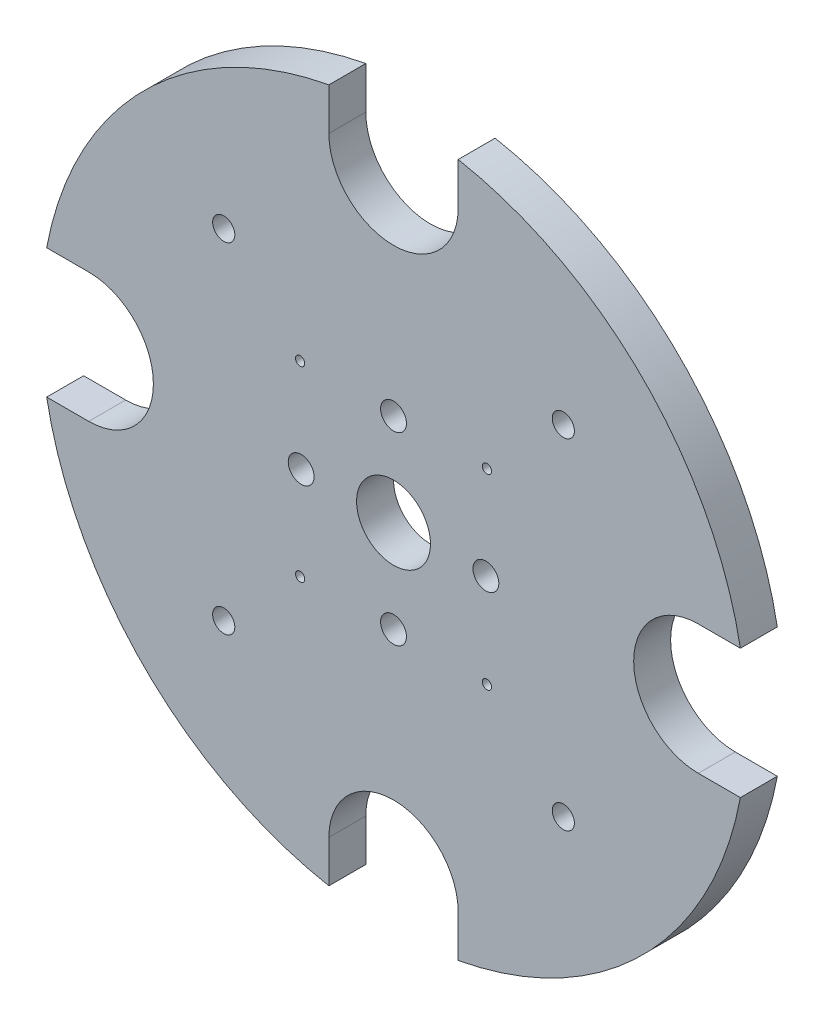
ISO-10303-21;
HEADER;
FILE_DESCRIPTION(('STEP AP214'),'2;1');
FILE_NAME('part.step','',(''),(''),'','','');
FILE_SCHEMA(('AUTOMOTIVE_DESIGN { 1 0 10303 214 1 1 1 1 }'));
ENDSEC;
DATA;
#1=APPLICATION_CONTEXT('core data for automotive mechanical design processes');
#2=APPLICATION_PROTOCOL_DEFINITION('international standard','automotive_design',2000,#1);
#3=PRODUCT_CONTEXT('',#1,'mechanical');
#4=PRODUCT('Part','Part','',(#3));
#5=PRODUCT_RELATED_PRODUCT_CATEGORY('part','',(#4));
#6=PRODUCT_DEFINITION_FORMATION('','',#4);
#7=PRODUCT_DEFINITION_CONTEXT('part definition',#1,'design');
#8=PRODUCT_DEFINITION('design','',#6,#7);
#9=PRODUCT_DEFINITION_SHAPE('','',#8);
#10=(LENGTH_UNIT() NAMED_UNIT(*) SI_UNIT(.MILLI.,.METRE.));
#11=(NAMED_UNIT(*) PLANE_ANGLE_UNIT() SI_UNIT($,.RADIAN.));
#12=(NAMED_UNIT(*) SI_UNIT($,.STERADIAN.) SOLID_ANGLE_UNIT());
#13=UNCERTAINTY_MEASURE_WITH_UNIT(LENGTH_MEASURE(1.E-05),#10,'distance_accuracy_value','');
#14=(GEOMETRIC_REPRESENTATION_CONTEXT(3) GLOBAL_UNCERTAINTY_ASSIGNED_CONTEXT((#13)) GLOBAL_UNIT_ASSIGNED_CONTEXT((#10,
#11,#12)) REPRESENTATION_CONTEXT('',''));
#15=CARTESIAN_POINT('',(0.,0.,0.));
#16=DIRECTION('',(0.,0.,1.));
#17=DIRECTION('',(1.,0.,0.));
#18=AXIS2_PLACEMENT_3D('',#15,#16,#17);
#19=CARTESIAN_POINT('',(0.,0.,20.));
#20=DIRECTION('',(0.,0.,-1.));
#21=DIRECTION('',(-1.,0.,0.));
#22=AXIS2_PLACEMENT_3D('',#19,#20,#21);
#23=CYLINDRICAL_SURFACE('',#22,191.);
#24=CARTESIAN_POINT('',(0.,0.,0.));
#25=DIRECTION('',(0.,0.,1.));
#26=DIRECTION('',(1.,0.,0.));
#27=AXIS2_PLACEMENT_3D('',#24,#25,#26);
#28=CIRCLE('',#27,191.);
#29=CARTESIAN_POINT('',(-35.,187.765811584538,0.));
#30=VERTEX_POINT('',#29);
#31=CARTESIAN_POINT('',(-187.765811584537,35.000000000002,0.));
#32=VERTEX_POINT('',#31);
#33=EDGE_CURVE('E342',#30,#32,#28,.T.);
#34=ORIENTED_EDGE('',*,*,#33,.T.);
#35=DIRECTION('',(0.,0.,1.));
#36=VECTOR('',#35,1.);
#37=CARTESIAN_POINT('',(-187.765811584537,35.000000000002,0.));
#38=LINE('',#37,#36);
#39=CARTESIAN_POINT('',(-187.765811584537,35.000000000002,20.0000000000001));
#40=VERTEX_POINT('',#39);
#41=EDGE_CURVE('E180',#32,#40,#38,.T.);
#42=ORIENTED_EDGE('',*,*,#41,.T.);
#43=CARTESIAN_POINT('',(0.,0.,20.));
#44=DIRECTION('',(0.,0.,1.));
#45=DIRECTION('',(1.,0.,0.));
#46=AXIS2_PLACEMENT_3D('',#43,#44,#45);
#47=CIRCLE('',#46,191.);
#48=CARTESIAN_POINT('',(-35.,187.765811584538,20.));
#49=VERTEX_POINT('',#48);
#50=EDGE_CURVE('E11',#49,#40,#47,.T.);
#51=ORIENTED_EDGE('',*,*,#50,.F.);
#52=DIRECTION('',(0.,0.,1.));
#53=VECTOR('',#52,1.);
#54=CARTESIAN_POINT('',(-35.,187.765811584538,0.));
#55=LINE('',#54,#53);
#56=EDGE_CURVE('E255',#30,#49,#55,.T.);
#57=ORIENTED_EDGE('',*,*,#56,.F.);
#58=EDGE_LOOP('',(#34,#42,#51,#57));
#59=FACE_BOUND('',#58,.T.);
#60=ADVANCED_FACE('F36',(#59),#23,.T.);
#61=CARTESIAN_POINT('',(-187.765811584538,-34.999999999998,20.));
#62=VERTEX_POINT('',#61);
#63=CARTESIAN_POINT('',(-35.0000000000014,-187.765811584537,20.0000000000001));
#64=VERTEX_POINT('',#63);
#65=EDGE_CURVE('E44',#62,#64,#47,.T.);
#66=ORIENTED_EDGE('',*,*,#65,.F.);
#67=DIRECTION('',(0.,0.,1.));
#68=VECTOR('',#67,1.);
#69=CARTESIAN_POINT('',(-187.765811584538,-34.999999999998,0.));
#70=LINE('',#69,#68);
#71=CARTESIAN_POINT('',(-187.765811584538,-34.999999999998,0.));
#72=VERTEX_POINT('',#71);
#73=EDGE_CURVE('E156',#72,#62,#70,.T.);
#74=ORIENTED_EDGE('',*,*,#73,.F.);
#75=CARTESIAN_POINT('',(-35.0000000000013,-187.765811584537,0.));
#76=VERTEX_POINT('',#75);
#77=EDGE_CURVE('E344',#72,#76,#28,.T.);
#78=ORIENTED_EDGE('',*,*,#77,.T.);
#79=DIRECTION('',(0.,0.,1.));
#80=VECTOR('',#79,1.);
#81=CARTESIAN_POINT('',(-35.0000000000013,-187.765811584537,0.));
#82=LINE('',#81,#80);
#83=EDGE_CURVE('E204',#76,#64,#82,.T.);
#84=ORIENTED_EDGE('',*,*,#83,.T.);
#85=EDGE_LOOP('',(#66,#74,#78,#84));
#86=FACE_BOUND('',#85,.T.);
#87=ADVANCED_FACE('F391',(#86),#23,.T.);
#88=CARTESIAN_POINT('',(34.9999999999987,-187.765811584538,20.));
#89=VERTEX_POINT('',#88);
#90=CARTESIAN_POINT('',(187.765811584538,-35.0000000000007,20.));
#91=VERTEX_POINT('',#90);
#92=EDGE_CURVE('E348',#89,#91,#47,.T.);
#93=ORIENTED_EDGE('',*,*,#92,.F.);
#94=DIRECTION('',(0.,0.,1.));
#95=VECTOR('',#94,1.);
#96=CARTESIAN_POINT('',(34.9999999999987,-187.765811584538,0.));
#97=LINE('',#96,#95);
#98=CARTESIAN_POINT('',(34.9999999999987,-187.765811584538,0.));
#99=VERTEX_POINT('',#98);
#100=EDGE_CURVE('E193',#99,#89,#97,.T.);
#101=ORIENTED_EDGE('',*,*,#100,.F.);
#102=CARTESIAN_POINT('',(187.765811584537,-35.0000000000007,0.));
#103=VERTEX_POINT('',#102);
#104=EDGE_CURVE('E349',#99,#103,#28,.T.);
#105=ORIENTED_EDGE('',*,*,#104,.T.);
#106=DIRECTION('',(0.,0.,1.));
#107=VECTOR('',#106,1.);
#108=CARTESIAN_POINT('',(187.765811584537,-35.0000000000007,0.));
#109=LINE('',#108,#107);
#110=EDGE_CURVE('E231',#103,#91,#109,.T.);
#111=ORIENTED_EDGE('',*,*,#110,.T.);
#112=EDGE_LOOP('',(#93,#101,#105,#111));
#113=FACE_BOUND('',#112,.T.);
#114=ADVANCED_FACE('F359',(#113),#23,.T.);
#115=CARTESIAN_POINT('',(187.765811584538,34.9999999999994,20.));
#116=VERTEX_POINT('',#115);
#117=CARTESIAN_POINT('',(35.,187.765811584538,19.9999999999999));
#118=VERTEX_POINT('',#117);
#119=EDGE_CURVE('E45',#116,#118,#47,.T.);
#120=ORIENTED_EDGE('',*,*,#119,.F.);
#121=DIRECTION('',(0.,0.,1.));
#122=VECTOR('',#121,1.);
#123=CARTESIAN_POINT('',(187.765811584538,34.9999999999994,0.));
#124=LINE('',#123,#122);
#125=CARTESIAN_POINT('',(187.765811584538,34.9999999999994,0.));
#126=VERTEX_POINT('',#125);
#127=EDGE_CURVE('E218',#126,#116,#124,.T.);
#128=ORIENTED_EDGE('',*,*,#127,.F.);
#129=CARTESIAN_POINT('',(35.,187.765811584538,0.));
#130=VERTEX_POINT('',#129);
#131=EDGE_CURVE('E341',#126,#130,#28,.T.);
#132=ORIENTED_EDGE('',*,*,#131,.T.);
#133=DIRECTION('',(0.,0.,1.));
#134=VECTOR('',#133,1.);
#135=CARTESIAN_POINT('',(35.,187.765811584538,0.));
#136=LINE('',#135,#134);
#137=EDGE_CURVE('E256',#130,#118,#136,.T.);
#138=ORIENTED_EDGE('',*,*,#137,.T.);
#139=EDGE_LOOP('',(#120,#128,#132,#138));
#140=FACE_BOUND('',#139,.T.);
#141=ADVANCED_FACE('F38',(#140),#23,.T.);
#142=CARTESIAN_POINT('',(0.,0.,20.));
#143=DIRECTION('',(0.,0.,1.));
#144=DIRECTION('',(1.,0.,0.));
#145=AXIS2_PLACEMENT_3D('',#142,#143,#144);
#146=PLANE('',#145);
#147=DIRECTION('',(-1.,0.,0.));
#148=VECTOR('',#147,1.);
#149=CARTESIAN_POINT('',(-165.,35.0000000000018,20.));
#150=LINE('',#149,#148);
#151=CARTESIAN_POINT('',(-165.,35.0000000000018,20.));
#152=VERTEX_POINT('',#151);
#153=EDGE_CURVE('E170',#152,#40,#150,.T.);
#154=ORIENTED_EDGE('',*,*,#153,.F.);
#155=CARTESIAN_POINT('',(-165.,1.74860126378462E-12,20.));
#156=DIRECTION('',(0.,0.,1.));
#157=DIRECTION('',(0.,1.,0.));
#158=AXIS2_PLACEMENT_3D('',#155,#156,#157);
#159=CIRCLE('',#158,35.);
#160=CARTESIAN_POINT('',(-165.,-34.9999999999983,20.));
#161=VERTEX_POINT('',#160);
#162=EDGE_CURVE('E163',#161,#152,#159,.T.);
#163=ORIENTED_EDGE('',*,*,#162,.F.);
#164=DIRECTION('',(1.,0.,0.));
#165=VECTOR('',#164,1.);
#166=CARTESIAN_POINT('',(-187.765811584538,-34.999999999998,20.));
#167=LINE('',#166,#165);
#168=EDGE_CURVE('E151',#62,#161,#167,.T.);
#169=ORIENTED_EDGE('',*,*,#168,.F.);
#170=ORIENTED_EDGE('',*,*,#65,.T.);
#171=DIRECTION('',(0.,-1.,0.));
#172=VECTOR('',#171,1.);
#173=CARTESIAN_POINT('',(-35.0000000000013,-165.,20.));
#174=LINE('',#173,#172);
#175=CARTESIAN_POINT('',(-35.0000000000013,-165.,20.));
#176=VERTEX_POINT('',#175);
#177=EDGE_CURVE('E201',#176,#64,#174,.T.);
#178=ORIENTED_EDGE('',*,*,#177,.F.);
#179=CARTESIAN_POINT('',(-1.16573417585641E-12,-165.,20.));
#180=DIRECTION('',(0.,0.,1.));
#181=DIRECTION('',(-1.,0.,0.));
#182=AXIS2_PLACEMENT_3D('',#179,#180,#181);
#183=CIRCLE('',#182,35.);
#184=CARTESIAN_POINT('',(34.9999999999988,-165.,20.));
#185=VERTEX_POINT('',#184);
#186=EDGE_CURVE('E195',#185,#176,#183,.T.);
#187=ORIENTED_EDGE('',*,*,#186,.F.);
#188=DIRECTION('',(0.,1.,0.));
#189=VECTOR('',#188,1.);
#190=CARTESIAN_POINT('',(34.9999999999987,-187.765811584538,20.));
#191=LINE('',#190,#189);
#192=EDGE_CURVE('E186',#89,#185,#191,.T.);
#193=ORIENTED_EDGE('',*,*,#192,.F.);
#194=ORIENTED_EDGE('',*,*,#92,.T.);
#195=DIRECTION('',(1.,0.,0.));
#196=VECTOR('',#195,1.);
#197=CARTESIAN_POINT('',(165.,-35.0000000000006,20.));
#198=LINE('',#197,#196);
#199=CARTESIAN_POINT('',(165.,-35.0000000000006,20.));
#200=VERTEX_POINT('',#199);
#201=EDGE_CURVE('E228',#200,#91,#198,.T.);
#202=ORIENTED_EDGE('',*,*,#201,.F.);
#203=CARTESIAN_POINT('',(165.,-5.55111512312578E-13,20.));
#204=DIRECTION('',(0.,0.,1.));
#205=DIRECTION('',(0.,-1.,0.));
#206=AXIS2_PLACEMENT_3D('',#203,#204,#205);
#207=CIRCLE('',#206,35.);
#208=CARTESIAN_POINT('',(165.,34.9999999999994,20.));
#209=VERTEX_POINT('',#208);
#210=EDGE_CURVE('E220',#209,#200,#207,.T.);
#211=ORIENTED_EDGE('',*,*,#210,.F.);
#212=DIRECTION('',(-1.,0.,0.));
#213=VECTOR('',#212,1.);
#214=CARTESIAN_POINT('',(187.765811584538,34.9999999999994,20.));
#215=LINE('',#214,#213);
#216=EDGE_CURVE('E210',#116,#209,#215,.T.);
#217=ORIENTED_EDGE('',*,*,#216,.F.);
#218=ORIENTED_EDGE('',*,*,#119,.T.);
#219=DIRECTION('',(0.,1.,0.));
#220=VECTOR('',#219,1.);
#221=CARTESIAN_POINT('',(35.,165.,20.));
#222=LINE('',#221,#220);
#223=CARTESIAN_POINT('',(35.,165.,20.));
#224=VERTEX_POINT('',#223);
#225=EDGE_CURVE('E243',#224,#118,#222,.T.);
#226=ORIENTED_EDGE('',*,*,#225,.F.);
#227=CARTESIAN_POINT('',(0.,165.,20.));
#228=DIRECTION('',(0.,0.,1.));
#229=DIRECTION('',(1.,0.,0.));
#230=AXIS2_PLACEMENT_3D('',#227,#228,#229);
#231=CIRCLE('',#230,35.);
#232=CARTESIAN_POINT('',(-35.,165.,20.));
#233=VERTEX_POINT('',#232);
#234=EDGE_CURVE('E240',#233,#224,#231,.T.);
#235=ORIENTED_EDGE('',*,*,#234,.F.);
#236=DIRECTION('',(0.,-1.,0.));
#237=VECTOR('',#236,1.);
#238=CARTESIAN_POINT('',(-35.,187.765811584538,20.));
#239=LINE('',#238,#237);
#240=EDGE_CURVE('E237',#49,#233,#239,.T.);
#241=ORIENTED_EDGE('',*,*,#240,.F.);
#242=ORIENTED_EDGE('',*,*,#50,.T.);
#243=EDGE_LOOP('',(#154,#163,#169,#170,#178,#187,#193,#194,#202,#211,#217,#218,#226,#235,#241,#242));
#244=FACE_BOUND('',#243,.T.);
#245=CARTESIAN_POINT('',(-91.9238815542505,91.923881554252,20.));
#246=DIRECTION('',(0.,0.,1.));
#247=DIRECTION('',(0.,1.,0.));
#248=AXIS2_PLACEMENT_3D('',#245,#246,#247);
#249=CIRCLE('',#248,6.);
#250=CARTESIAN_POINT('',(-91.9238815542504,97.923881554252,20.));
#251=VERTEX_POINT('',#250);
#252=EDGE_CURVE('E267',#251,#251,#249,.T.);
#253=ORIENTED_EDGE('',*,*,#252,.F.);
#254=EDGE_LOOP('',(#253));
#255=FACE_BOUND('',#254,.T.);
#256=CARTESIAN_POINT('',(-91.9238815542517,-91.9238815542507,20.));
#257=DIRECTION('',(0.,0.,1.));
#258=DIRECTION('',(-1.,0.,0.));
#259=AXIS2_PLACEMENT_3D('',#256,#257,#258);
#260=CIRCLE('',#259,6.);
#261=CARTESIAN_POINT('',(-97.9238815542517,-91.9238815542507,20.));
#262=VERTEX_POINT('',#261);
#263=EDGE_CURVE('E273',#262,#262,#260,.T.);
#264=ORIENTED_EDGE('',*,*,#263,.F.);
#265=EDGE_LOOP('',(#264));
#266=FACE_BOUND('',#265,.T.);
#267=CARTESIAN_POINT('',(91.923881554251,-91.9238815542514,20.));
#268=DIRECTION('',(0.,0.,1.));
#269=DIRECTION('',(0.,-1.,0.));
#270=AXIS2_PLACEMENT_3D('',#267,#268,#269);
#271=CIRCLE('',#270,6.);
#272=CARTESIAN_POINT('',(91.923881554251,-97.9238815542514,20.));
#273=VERTEX_POINT('',#272);
#274=EDGE_CURVE('E279',#273,#273,#271,.T.);
#275=ORIENTED_EDGE('',*,*,#274,.F.);
#276=EDGE_LOOP('',(#275));
#277=FACE_BOUND('',#276,.T.);
#278=CARTESIAN_POINT('',(-50.5581348548377,50.5581348548386,20.));
#279=DIRECTION('',(0.,0.,1.));
#280=DIRECTION('',(0.,1.,0.));
#281=AXIS2_PLACEMENT_3D('',#278,#279,#280);
#282=CIRCLE('',#281,2.5);
#283=CARTESIAN_POINT('',(-50.5581348548377,53.0581348548386,20.));
#284=VERTEX_POINT('',#283);
#285=EDGE_CURVE('E285',#284,#284,#282,.T.);
#286=ORIENTED_EDGE('',*,*,#285,.F.);
#287=EDGE_LOOP('',(#286));
#288=FACE_BOUND('',#287,.T.);
#289=CARTESIAN_POINT('',(-50.5581348548385,-50.5581348548379,20.));
#290=DIRECTION('',(0.,0.,1.));
#291=DIRECTION('',(-1.,0.,0.));
#292=AXIS2_PLACEMENT_3D('',#289,#290,#291);
#293=CIRCLE('',#292,2.5);
#294=CARTESIAN_POINT('',(-53.0581348548385,-50.5581348548379,20.));
#295=VERTEX_POINT('',#294);
#296=EDGE_CURVE('E291',#295,#295,#293,.T.);
#297=ORIENTED_EDGE('',*,*,#296,.F.);
#298=EDGE_LOOP('',(#297));
#299=FACE_BOUND('',#298,.T.);
#300=CARTESIAN_POINT('',(50.5581348548381,-50.5581348548383,20.));
#301=DIRECTION('',(0.,0.,1.));
#302=DIRECTION('',(0.,-1.,0.));
#303=AXIS2_PLACEMENT_3D('',#300,#301,#302);
#304=CIRCLE('',#303,2.5);
#305=CARTESIAN_POINT('',(50.5581348548381,-53.0581348548383,20.));
#306=VERTEX_POINT('',#305);
#307=EDGE_CURVE('E297',#306,#306,#304,.T.);
#308=ORIENTED_EDGE('',*,*,#307,.F.);
#309=EDGE_LOOP('',(#308));
#310=FACE_BOUND('',#309,.T.);
#311=CARTESIAN_POINT('',(50.5581348548381,50.5581348548383,20.));
#312=DIRECTION('',(0.,0.,1.));
#313=DIRECTION('',(1.,0.,0.));
#314=AXIS2_PLACEMENT_3D('',#311,#312,#313);
#315=CIRCLE('',#314,2.5);
#316=CARTESIAN_POINT('',(53.0581348548381,50.5581348548383,20.));
#317=VERTEX_POINT('',#316);
#318=EDGE_CURVE('E300',#317,#317,#315,.T.);
#319=ORIENTED_EDGE('',*,*,#318,.F.);
#320=EDGE_LOOP('',(#319));
#321=FACE_BOUND('',#320,.T.);
#322=CARTESIAN_POINT('',(91.923881554251,91.9238815542514,20.));
#323=DIRECTION('',(0.,0.,1.));
#324=DIRECTION('',(1.,0.,0.));
#325=AXIS2_PLACEMENT_3D('',#322,#323,#324);
#326=CIRCLE('',#325,6.);
#327=CARTESIAN_POINT('',(97.923881554251,91.9238815542514,20.));
#328=VERTEX_POINT('',#327);
#329=EDGE_CURVE('E306',#328,#328,#326,.T.);
#330=ORIENTED_EDGE('',*,*,#329,.F.);
#331=EDGE_LOOP('',(#330));
#332=FACE_BOUND('',#331,.T.);
#333=CARTESIAN_POINT('',(4.9960036108132E-13,50.,20.));
#334=DIRECTION('',(0.,0.,1.));
#335=DIRECTION('',(0.,1.,0.));
#336=AXIS2_PLACEMENT_3D('',#333,#334,#335);
#337=CIRCLE('',#336,7.);
#338=CARTESIAN_POINT('',(5.72921511664617E-13,57.,20.));
#339=VERTEX_POINT('',#338);
#340=EDGE_CURVE('E315',#339,#339,#337,.T.);
#341=ORIENTED_EDGE('',*,*,#340,.F.);
#342=EDGE_LOOP('',(#341));
#343=FACE_BOUND('',#342,.T.);
#344=CARTESIAN_POINT('',(-50.,3.67761376907083E-13,20.));
#345=DIRECTION('',(0.,0.,1.));
#346=DIRECTION('',(-1.,0.,0.));
#347=AXIS2_PLACEMENT_3D('',#344,#345,#346);
#348=CIRCLE('',#347,7.);
#349=CARTESIAN_POINT('',(-57.,4.16642143962615E-13,20.));
#350=VERTEX_POINT('',#349);
#351=EDGE_CURVE('E321',#350,#350,#348,.T.);
#352=ORIENTED_EDGE('',*,*,#351,.F.);
#353=EDGE_LOOP('',(#352));
#354=FACE_BOUND('',#353,.T.);
#355=CARTESIAN_POINT('',(-1.66533453693773E-13,-50.,20.));
#356=DIRECTION('',(0.,0.,1.));
#357=DIRECTION('',(0.,-1.,0.));
#358=AXIS2_PLACEMENT_3D('',#355,#356,#357);
#359=CIRCLE('',#358,7.);
#360=CARTESIAN_POINT('',(-1.90973837221539E-13,-57.,20.));
#361=VERTEX_POINT('',#360);
#362=EDGE_CURVE('E327',#361,#361,#359,.T.);
#363=ORIENTED_EDGE('',*,*,#362,.F.);
#364=EDGE_LOOP('',(#363));
#365=FACE_BOUND('',#364,.T.);
#366=CARTESIAN_POINT('',(50.,0.,20.));
#367=DIRECTION('',(0.,0.,1.));
#368=DIRECTION('',(1.,0.,0.));
#369=AXIS2_PLACEMENT_3D('',#366,#367,#368);
#370=CIRCLE('',#369,7.);
#371=CARTESIAN_POINT('',(57.,0.,20.));
#372=VERTEX_POINT('',#371);
#373=EDGE_CURVE('E330',#372,#372,#370,.T.);
#374=ORIENTED_EDGE('',*,*,#373,.F.);
#375=EDGE_LOOP('',(#374));
#376=FACE_BOUND('',#375,.T.);
#377=CARTESIAN_POINT('',(0.,0.,20.));
#378=DIRECTION('',(0.,0.,1.));
#379=DIRECTION('',(1.,0.,0.));
#380=AXIS2_PLACEMENT_3D('',#377,#378,#379);
#381=CIRCLE('',#380,20.);
#382=CARTESIAN_POINT('',(20.,0.,20.));
#383=VERTEX_POINT('',#382);
#384=EDGE_CURVE('E336',#383,#383,#381,.T.);
#385=ORIENTED_EDGE('',*,*,#384,.F.);
#386=EDGE_LOOP('',(#385));
#387=FACE_BOUND('',#386,.T.);
#388=ADVANCED_FACE('F168',(#244,#255,#266,#277,#288,#299,#310,#321,#332,#343,#354,#365,#376,
#387),#146,.T.);
#389=CARTESIAN_POINT('',(0.,0.,0.));
#390=DIRECTION('',(0.,0.,1.));
#391=DIRECTION('',(1.,0.,0.));
#392=AXIS2_PLACEMENT_3D('',#389,#390,#391);
#393=PLANE('',#392);
#394=CARTESIAN_POINT('',(-91.9238815542504,91.923881554252,0.));
#395=DIRECTION('',(0.,0.,1.));
#396=DIRECTION('',(0.,1.,0.));
#397=AXIS2_PLACEMENT_3D('',#394,#395,#396);
#398=CIRCLE('',#397,6.);
#399=CARTESIAN_POINT('',(-91.9238815542503,97.923881554252,0.));
#400=VERTEX_POINT('',#399);
#401=EDGE_CURVE('E259',#400,#400,#398,.T.);
#402=ORIENTED_EDGE('',*,*,#401,.T.);
#403=EDGE_LOOP('',(#402));
#404=FACE_BOUND('',#403,.T.);
#405=CARTESIAN_POINT('',(-91.9238815542517,-91.9238815542507,0.));
#406=DIRECTION('',(0.,0.,1.));
#407=DIRECTION('',(-1.,0.,0.));
#408=AXIS2_PLACEMENT_3D('',#405,#406,#407);
#409=CIRCLE('',#408,6.);
#410=CARTESIAN_POINT('',(-97.9238815542517,-91.9238815542507,0.));
#411=VERTEX_POINT('',#410);
#412=EDGE_CURVE('E270',#411,#411,#409,.T.);
#413=ORIENTED_EDGE('',*,*,#412,.T.);
#414=EDGE_LOOP('',(#413));
#415=FACE_BOUND('',#414,.T.);
#416=CARTESIAN_POINT('',(91.923881554251,-91.9238815542514,0.));
#417=DIRECTION('',(0.,0.,1.));
#418=DIRECTION('',(0.,-1.,0.));
#419=AXIS2_PLACEMENT_3D('',#416,#417,#418);
#420=CIRCLE('',#419,6.);
#421=CARTESIAN_POINT('',(91.923881554251,-97.9238815542514,0.));
#422=VERTEX_POINT('',#421);
#423=EDGE_CURVE('E276',#422,#422,#420,.T.);
#424=ORIENTED_EDGE('',*,*,#423,.T.);
#425=EDGE_LOOP('',(#424));
#426=FACE_BOUND('',#425,.T.);
#427=CARTESIAN_POINT('',(-50.5581348548377,50.5581348548386,0.));
#428=DIRECTION('',(0.,0.,1.));
#429=DIRECTION('',(0.,1.,0.));
#430=AXIS2_PLACEMENT_3D('',#427,#428,#429);
#431=CIRCLE('',#430,2.5);
#432=CARTESIAN_POINT('',(-50.5581348548377,53.0581348548386,0.));
#433=VERTEX_POINT('',#432);
#434=EDGE_CURVE('E282',#433,#433,#431,.T.);
#435=ORIENTED_EDGE('',*,*,#434,.T.);
#436=EDGE_LOOP('',(#435));
#437=FACE_BOUND('',#436,.T.);
#438=CARTESIAN_POINT('',(-50.5581348548384,-50.5581348548379,0.));
#439=DIRECTION('',(0.,0.,1.));
#440=DIRECTION('',(-1.,0.,0.));
#441=AXIS2_PLACEMENT_3D('',#438,#439,#440);
#442=CIRCLE('',#441,2.5);
#443=CARTESIAN_POINT('',(-53.0581348548384,-50.5581348548379,0.));
#444=VERTEX_POINT('',#443);
#445=EDGE_CURVE('E288',#444,#444,#442,.T.);
#446=ORIENTED_EDGE('',*,*,#445,.T.);
#447=EDGE_LOOP('',(#446));
#448=FACE_BOUND('',#447,.T.);
#449=CARTESIAN_POINT('',(50.5581348548381,-50.5581348548383,0.));
#450=DIRECTION('',(0.,0.,1.));
#451=DIRECTION('',(0.,-1.,0.));
#452=AXIS2_PLACEMENT_3D('',#449,#450,#451);
#453=CIRCLE('',#452,2.5);
#454=CARTESIAN_POINT('',(50.5581348548381,-53.0581348548383,0.));
#455=VERTEX_POINT('',#454);
#456=EDGE_CURVE('E294',#455,#455,#453,.T.);
#457=ORIENTED_EDGE('',*,*,#456,.T.);
#458=EDGE_LOOP('',(#457));
#459=FACE_BOUND('',#458,.T.);
#460=CARTESIAN_POINT('',(50.5581348548381,50.5581348548383,0.));
#461=DIRECTION('',(0.,0.,1.));
#462=DIRECTION('',(1.,0.,0.));
#463=AXIS2_PLACEMENT_3D('',#460,#461,#462);
#464=CIRCLE('',#463,2.5);
#465=CARTESIAN_POINT('',(53.0581348548381,50.5581348548383,0.));
#466=VERTEX_POINT('',#465);
#467=EDGE_CURVE('E303',#466,#466,#464,.T.);
#468=ORIENTED_EDGE('',*,*,#467,.T.);
#469=EDGE_LOOP('',(#468));
#470=FACE_BOUND('',#469,.T.);
#471=CARTESIAN_POINT('',(91.923881554251,91.9238815542514,0.));
#472=DIRECTION('',(0.,0.,1.));
#473=DIRECTION('',(1.,0.,0.));
#474=AXIS2_PLACEMENT_3D('',#471,#472,#473);
#475=CIRCLE('',#474,6.);
#476=CARTESIAN_POINT('',(97.923881554251,91.9238815542514,0.));
#477=VERTEX_POINT('',#476);
#478=EDGE_CURVE('E309',#477,#477,#475,.T.);
#479=ORIENTED_EDGE('',*,*,#478,.T.);
#480=EDGE_LOOP('',(#479));
#481=FACE_BOUND('',#480,.T.);
#482=CARTESIAN_POINT('',(4.9960036108132E-13,50.,0.));
#483=DIRECTION('',(0.,0.,1.));
#484=DIRECTION('',(0.,1.,0.));
#485=AXIS2_PLACEMENT_3D('',#482,#483,#484);
#486=CIRCLE('',#485,7.);
#487=CARTESIAN_POINT('',(5.72921511664617E-13,57.,0.));
#488=VERTEX_POINT('',#487);
#489=EDGE_CURVE('E312',#488,#488,#486,.T.);
#490=ORIENTED_EDGE('',*,*,#489,.T.);
#491=EDGE_LOOP('',(#490));
#492=FACE_BOUND('',#491,.T.);
#493=CARTESIAN_POINT('',(-50.,3.53883589099269E-13,0.));
#494=DIRECTION('',(0.,0.,1.));
#495=DIRECTION('',(-1.,0.,0.));
#496=AXIS2_PLACEMENT_3D('',#493,#494,#495);
#497=CIRCLE('',#496,7.);
#498=CARTESIAN_POINT('',(-57.,4.027643561548E-13,0.));
#499=VERTEX_POINT('',#498);
#500=EDGE_CURVE('E318',#499,#499,#497,.T.);
#501=ORIENTED_EDGE('',*,*,#500,.T.);
#502=EDGE_LOOP('',(#501));
#503=FACE_BOUND('',#502,.T.);
#504=CARTESIAN_POINT('',(-1.66533453693773E-13,-50.,0.));
#505=DIRECTION('',(0.,0.,1.));
#506=DIRECTION('',(0.,-1.,0.));
#507=AXIS2_PLACEMENT_3D('',#504,#505,#506);
#508=CIRCLE('',#507,7.);
#509=CARTESIAN_POINT('',(-1.90973837221539E-13,-57.,0.));
#510=VERTEX_POINT('',#509);
#511=EDGE_CURVE('E324',#510,#510,#508,.T.);
#512=ORIENTED_EDGE('',*,*,#511,.T.);
#513=EDGE_LOOP('',(#512));
#514=FACE_BOUND('',#513,.T.);
#515=CARTESIAN_POINT('',(50.,0.,0.));
#516=DIRECTION('',(0.,0.,1.));
#517=DIRECTION('',(1.,0.,0.));
#518=AXIS2_PLACEMENT_3D('',#515,#516,#517);
#519=CIRCLE('',#518,7.);
#520=CARTESIAN_POINT('',(57.,0.,0.));
#521=VERTEX_POINT('',#520);
#522=EDGE_CURVE('E333',#521,#521,#519,.T.);
#523=ORIENTED_EDGE('',*,*,#522,.T.);
#524=EDGE_LOOP('',(#523));
#525=FACE_BOUND('',#524,.T.);
#526=CARTESIAN_POINT('',(0.,0.,0.));
#527=DIRECTION('',(0.,0.,1.));
#528=DIRECTION('',(1.,0.,0.));
#529=AXIS2_PLACEMENT_3D('',#526,#527,#528);
#530=CIRCLE('',#529,20.);
#531=CARTESIAN_POINT('',(20.,0.,0.));
#532=VERTEX_POINT('',#531);
#533=EDGE_CURVE('E339',#532,#532,#530,.T.);
#534=ORIENTED_EDGE('',*,*,#533,.T.);
#535=EDGE_LOOP('',(#534));
#536=FACE_BOUND('',#535,.T.);
#537=CARTESIAN_POINT('',(-165.,1.74860126378462E-12,0.));
#538=DIRECTION('',(0.,0.,1.));
#539=DIRECTION('',(0.,1.,0.));
#540=AXIS2_PLACEMENT_3D('',#537,#538,#539);
#541=CIRCLE('',#540,35.);
#542=CARTESIAN_POINT('',(-165.,-34.9999999999983,0.));
#543=VERTEX_POINT('',#542);
#544=CARTESIAN_POINT('',(-165.,35.0000000000018,0.));
#545=VERTEX_POINT('',#544);
#546=EDGE_CURVE('E52',#543,#545,#541,.T.);
#547=ORIENTED_EDGE('',*,*,#546,.T.);
#548=DIRECTION('',(-1.,0.,0.));
#549=VECTOR('',#548,1.);
#550=CARTESIAN_POINT('',(-165.,35.0000000000018,0.));
#551=LINE('',#550,#549);
#552=EDGE_CURVE('E183',#545,#32,#551,.T.);
#553=ORIENTED_EDGE('',*,*,#552,.T.);
#554=ORIENTED_EDGE('',*,*,#33,.F.);
#555=DIRECTION('',(0.,-1.,0.));
#556=VECTOR('',#555,1.);
#557=CARTESIAN_POINT('',(-35.,187.765811584538,0.));
#558=LINE('',#557,#556);
#559=CARTESIAN_POINT('',(-35.,165.,0.));
#560=VERTEX_POINT('',#559);
#561=EDGE_CURVE('E246',#30,#560,#558,.T.);
#562=ORIENTED_EDGE('',*,*,#561,.T.);
#563=CARTESIAN_POINT('',(0.,165.,0.));
#564=DIRECTION('',(0.,0.,1.));
#565=DIRECTION('',(1.,0.,0.));
#566=AXIS2_PLACEMENT_3D('',#563,#564,#565);
#567=CIRCLE('',#566,35.);
#568=CARTESIAN_POINT('',(35.,165.,0.));
#569=VERTEX_POINT('',#568);
#570=EDGE_CURVE('E249',#560,#569,#567,.T.);
#571=ORIENTED_EDGE('',*,*,#570,.T.);
#572=DIRECTION('',(0.,1.,0.));
#573=VECTOR('',#572,1.);
#574=CARTESIAN_POINT('',(35.,165.,0.));
#575=LINE('',#574,#573);
#576=EDGE_CURVE('E252',#569,#130,#575,.T.);
#577=ORIENTED_EDGE('',*,*,#576,.T.);
#578=ORIENTED_EDGE('',*,*,#131,.F.);
#579=DIRECTION('',(-1.,0.,0.));
#580=VECTOR('',#579,1.);
#581=CARTESIAN_POINT('',(187.765811584538,34.9999999999994,0.));
#582=LINE('',#581,#580);
#583=CARTESIAN_POINT('',(165.,34.9999999999994,0.));
#584=VERTEX_POINT('',#583);
#585=EDGE_CURVE('E215',#126,#584,#582,.T.);
#586=ORIENTED_EDGE('',*,*,#585,.T.);
#587=CARTESIAN_POINT('',(165.,-5.759281940243E-13,0.));
#588=DIRECTION('',(0.,0.,1.));
#589=DIRECTION('',(0.,-1.,0.));
#590=AXIS2_PLACEMENT_3D('',#587,#588,#589);
#591=CIRCLE('',#590,35.);
#592=CARTESIAN_POINT('',(165.,-35.0000000000006,0.));
#593=VERTEX_POINT('',#592);
#594=EDGE_CURVE('E225',#584,#593,#591,.T.);
#595=ORIENTED_EDGE('',*,*,#594,.T.);
#596=DIRECTION('',(1.,0.,0.));
#597=VECTOR('',#596,1.);
#598=CARTESIAN_POINT('',(165.,-35.0000000000006,0.));
#599=LINE('',#598,#597);
#600=EDGE_CURVE('E234',#593,#103,#599,.T.);
#601=ORIENTED_EDGE('',*,*,#600,.T.);
#602=ORIENTED_EDGE('',*,*,#104,.F.);
#603=DIRECTION('',(0.,1.,0.));
#604=VECTOR('',#603,1.);
#605=CARTESIAN_POINT('',(34.9999999999987,-187.765811584538,0.));
#606=LINE('',#605,#604);
#607=CARTESIAN_POINT('',(34.9999999999989,-165.,0.));
#608=VERTEX_POINT('',#607);
#609=EDGE_CURVE('E190',#99,#608,#606,.T.);
#610=ORIENTED_EDGE('',*,*,#609,.T.);
#611=CARTESIAN_POINT('',(-1.16573417585641E-12,-165.,0.));
#612=DIRECTION('',(0.,0.,1.));
#613=DIRECTION('',(-1.,0.,0.));
#614=AXIS2_PLACEMENT_3D('',#611,#612,#613);
#615=CIRCLE('',#614,35.);
#616=CARTESIAN_POINT('',(-35.0000000000011,-165.,0.));
#617=VERTEX_POINT('',#616);
#618=EDGE_CURVE('E60',#608,#617,#615,.T.);
#619=ORIENTED_EDGE('',*,*,#618,.T.);
#620=DIRECTION('',(0.,-1.,0.));
#621=VECTOR('',#620,1.);
#622=CARTESIAN_POINT('',(-35.0000000000011,-165.,0.));
#623=LINE('',#622,#621);
#624=EDGE_CURVE('E207',#617,#76,#623,.T.);
#625=ORIENTED_EDGE('',*,*,#624,.T.);
#626=ORIENTED_EDGE('',*,*,#77,.F.);
#627=DIRECTION('',(1.,0.,0.));
#628=VECTOR('',#627,1.);
#629=CARTESIAN_POINT('',(-187.765811584538,-34.999999999998,0.));
#630=LINE('',#629,#628);
#631=EDGE_CURVE('E165',#72,#543,#630,.T.);
#632=ORIENTED_EDGE('',*,*,#631,.T.);
#633=EDGE_LOOP('',(#547,#553,#554,#562,#571,#577,#578,#586,#595,#601,#602,#610,#619,#625,#626,#632));
#634=FACE_BOUND('',#633,.T.);
#635=ADVANCED_FACE('F365',(#404,#415,#426,#437,#448,#459,#470,#481,#492,#503,#514,#525,#536,
#634),#393,.F.);
#636=CARTESIAN_POINT('',(0.,0.,0.));
#637=DIRECTION('',(0.,0.,1.));
#638=DIRECTION('',(1.,0.,0.));
#639=AXIS2_PLACEMENT_3D('',#636,#637,#638);
#640=CYLINDRICAL_SURFACE('',#639,20.);
#641=ORIENTED_EDGE('',*,*,#533,.F.);
#642=EDGE_LOOP('',(#641));
#643=FACE_BOUND('',#642,.T.);
#644=ORIENTED_EDGE('',*,*,#384,.T.);
#645=EDGE_LOOP('',(#644));
#646=FACE_BOUND('',#645,.T.);
#647=ADVANCED_FACE('F457',(#643,#646),#640,.F.);
#648=CARTESIAN_POINT('',(50.,0.,0.));
#649=DIRECTION('',(0.,0.,1.));
#650=DIRECTION('',(1.,0.,0.));
#651=AXIS2_PLACEMENT_3D('',#648,#649,#650);
#652=CYLINDRICAL_SURFACE('',#651,7.);
#653=ORIENTED_EDGE('',*,*,#522,.F.);
#654=EDGE_LOOP('',(#653));
#655=FACE_BOUND('',#654,.T.);
#656=ORIENTED_EDGE('',*,*,#373,.T.);
#657=EDGE_LOOP('',(#656));
#658=FACE_BOUND('',#657,.T.);
#659=ADVANCED_FACE('F468',(#655,#658),#652,.F.);
#660=CARTESIAN_POINT('',(-1.66533453693773E-13,-50.,0.));
#661=DIRECTION('',(0.,0.,1.));
#662=DIRECTION('',(0.,-1.,0.));
#663=AXIS2_PLACEMENT_3D('',#660,#661,#662);
#664=CYLINDRICAL_SURFACE('',#663,7.);
#665=ORIENTED_EDGE('',*,*,#511,.F.);
#666=EDGE_LOOP('',(#665));
#667=FACE_BOUND('',#666,.T.);
#668=ORIENTED_EDGE('',*,*,#362,.T.);
#669=EDGE_LOOP('',(#668));
#670=FACE_BOUND('',#669,.T.);
#671=ADVANCED_FACE('F480',(#667,#670),#664,.F.);
#672=CARTESIAN_POINT('',(-50.,3.53883589099269E-13,0.));
#673=DIRECTION('',(0.,0.,1.));
#674=DIRECTION('',(-1.,0.,0.));
#675=AXIS2_PLACEMENT_3D('',#672,#673,#674);
#676=CYLINDRICAL_SURFACE('',#675,7.);
#677=ORIENTED_EDGE('',*,*,#500,.F.);
#678=EDGE_LOOP('',(#677));
#679=FACE_BOUND('',#678,.T.);
#680=ORIENTED_EDGE('',*,*,#351,.T.);
#681=EDGE_LOOP('',(#680));
#682=FACE_BOUND('',#681,.T.);
#683=ADVANCED_FACE('F492',(#679,#682),#676,.F.);
#684=CARTESIAN_POINT('',(4.9960036108132E-13,50.,0.));
#685=DIRECTION('',(0.,0.,1.));
#686=DIRECTION('',(0.,1.,0.));
#687=AXIS2_PLACEMENT_3D('',#684,#685,#686);
#688=CYLINDRICAL_SURFACE('',#687,7.);
#689=ORIENTED_EDGE('',*,*,#489,.F.);
#690=EDGE_LOOP('',(#689));
#691=FACE_BOUND('',#690,.T.);
#692=ORIENTED_EDGE('',*,*,#340,.T.);
#693=EDGE_LOOP('',(#692));
#694=FACE_BOUND('',#693,.T.);
#695=ADVANCED_FACE('F504',(#691,#694),#688,.F.);
#696=CARTESIAN_POINT('',(91.923881554251,91.9238815542514,0.));
#697=DIRECTION('',(0.,0.,1.));
#698=DIRECTION('',(1.,0.,0.));
#699=AXIS2_PLACEMENT_3D('',#696,#697,#698);
#700=CYLINDRICAL_SURFACE('',#699,6.);
#701=ORIENTED_EDGE('',*,*,#478,.F.);
#702=EDGE_LOOP('',(#701));
#703=FACE_BOUND('',#702,.T.);
#704=ORIENTED_EDGE('',*,*,#329,.T.);
#705=EDGE_LOOP('',(#704));
#706=FACE_BOUND('',#705,.T.);
#707=ADVANCED_FACE('F514',(#703,#706),#700,.F.);
#708=CARTESIAN_POINT('',(50.5581348548381,50.5581348548383,0.));
#709=DIRECTION('',(0.,0.,1.));
#710=DIRECTION('',(1.,0.,0.));
#711=AXIS2_PLACEMENT_3D('',#708,#709,#710);
#712=CYLINDRICAL_SURFACE('',#711,2.5);
#713=ORIENTED_EDGE('',*,*,#467,.F.);
#714=EDGE_LOOP('',(#713));
#715=FACE_BOUND('',#714,.T.);
#716=ORIENTED_EDGE('',*,*,#318,.T.);
#717=EDGE_LOOP('',(#716));
#718=FACE_BOUND('',#717,.T.);
#719=ADVANCED_FACE('F524',(#715,#718),#712,.F.);
#720=CARTESIAN_POINT('',(50.5581348548381,-50.5581348548383,0.));
#721=DIRECTION('',(0.,0.,1.));
#722=DIRECTION('',(0.,-1.,0.));
#723=AXIS2_PLACEMENT_3D('',#720,#721,#722);
#724=CYLINDRICAL_SURFACE('',#723,2.5);
#725=ORIENTED_EDGE('',*,*,#456,.F.);
#726=EDGE_LOOP('',(#725));
#727=FACE_BOUND('',#726,.T.);
#728=ORIENTED_EDGE('',*,*,#307,.T.);
#729=EDGE_LOOP('',(#728));
#730=FACE_BOUND('',#729,.T.);
#731=ADVANCED_FACE('F534',(#727,#730),#724,.F.);
#732=CARTESIAN_POINT('',(-50.5581348548384,-50.5581348548379,0.));
#733=DIRECTION('',(0.,0.,1.));
#734=DIRECTION('',(-1.,0.,0.));
#735=AXIS2_PLACEMENT_3D('',#732,#733,#734);
#736=CYLINDRICAL_SURFACE('',#735,2.5);
#737=ORIENTED_EDGE('',*,*,#445,.F.);
#738=EDGE_LOOP('',(#737));
#739=FACE_BOUND('',#738,.T.);
#740=ORIENTED_EDGE('',*,*,#296,.T.);
#741=EDGE_LOOP('',(#740));
#742=FACE_BOUND('',#741,.T.);
#743=ADVANCED_FACE('F544',(#739,#742),#736,.F.);
#744=CARTESIAN_POINT('',(-50.5581348548377,50.5581348548386,0.));
#745=DIRECTION('',(0.,0.,1.));
#746=DIRECTION('',(0.,1.,0.));
#747=AXIS2_PLACEMENT_3D('',#744,#745,#746);
#748=CYLINDRICAL_SURFACE('',#747,2.5);
#749=ORIENTED_EDGE('',*,*,#434,.F.);
#750=EDGE_LOOP('',(#749));
#751=FACE_BOUND('',#750,.T.);
#752=ORIENTED_EDGE('',*,*,#285,.T.);
#753=EDGE_LOOP('',(#752));
#754=FACE_BOUND('',#753,.T.);
#755=ADVANCED_FACE('F554',(#751,#754),#748,.F.);
#756=CARTESIAN_POINT('',(91.923881554251,-91.9238815542514,0.));
#757=DIRECTION('',(0.,0.,1.));
#758=DIRECTION('',(0.,-1.,0.));
#759=AXIS2_PLACEMENT_3D('',#756,#757,#758);
#760=CYLINDRICAL_SURFACE('',#759,6.);
#761=ORIENTED_EDGE('',*,*,#423,.F.);
#762=EDGE_LOOP('',(#761));
#763=FACE_BOUND('',#762,.T.);
#764=ORIENTED_EDGE('',*,*,#274,.T.);
#765=EDGE_LOOP('',(#764));
#766=FACE_BOUND('',#765,.T.);
#767=ADVANCED_FACE('F564',(#763,#766),#760,.F.);
#768=CARTESIAN_POINT('',(-91.9238815542517,-91.9238815542507,0.));
#769=DIRECTION('',(0.,0.,1.));
#770=DIRECTION('',(-1.,0.,0.));
#771=AXIS2_PLACEMENT_3D('',#768,#769,#770);
#772=CYLINDRICAL_SURFACE('',#771,6.);
#773=ORIENTED_EDGE('',*,*,#412,.F.);
#774=EDGE_LOOP('',(#773));
#775=FACE_BOUND('',#774,.T.);
#776=ORIENTED_EDGE('',*,*,#263,.T.);
#777=EDGE_LOOP('',(#776));
#778=FACE_BOUND('',#777,.T.);
#779=ADVANCED_FACE('F574',(#775,#778),#772,.F.);
#780=CARTESIAN_POINT('',(-91.9238815542504,91.923881554252,0.));
#781=DIRECTION('',(0.,0.,1.));
#782=DIRECTION('',(0.,1.,0.));
#783=AXIS2_PLACEMENT_3D('',#780,#781,#782);
#784=CYLINDRICAL_SURFACE('',#783,6.);
#785=ORIENTED_EDGE('',*,*,#401,.F.);
#786=EDGE_LOOP('',(#785));
#787=FACE_BOUND('',#786,.T.);
#788=ORIENTED_EDGE('',*,*,#252,.T.);
#789=EDGE_LOOP('',(#788));
#790=FACE_BOUND('',#789,.T.);
#791=ADVANCED_FACE('F584',(#787,#790),#784,.F.);
#792=CARTESIAN_POINT('',(35.,165.,0.));
#793=DIRECTION('',(1.,0.,0.));
#794=DIRECTION('',(0.,0.,-1.));
#795=AXIS2_PLACEMENT_3D('',#792,#793,#794);
#796=PLANE('',#795);
#797=ORIENTED_EDGE('',*,*,#225,.T.);
#798=ORIENTED_EDGE('',*,*,#137,.F.);
#799=ORIENTED_EDGE('',*,*,#576,.F.);
#800=DIRECTION('',(0.,0.,1.));
#801=VECTOR('',#800,1.);
#802=CARTESIAN_POINT('',(35.,165.,0.));
#803=LINE('',#802,#801);
#804=EDGE_CURVE('E260',#569,#224,#803,.T.);
#805=ORIENTED_EDGE('',*,*,#804,.T.);
#806=EDGE_LOOP('',(#797,#798,#799,#805));
#807=FACE_BOUND('',#806,.T.);
#808=ADVANCED_FACE('F377',(#807),#796,.F.);
#809=CARTESIAN_POINT('',(0.,165.,0.));
#810=DIRECTION('',(0.,0.,1.));
#811=DIRECTION('',(1.,0.,0.));
#812=AXIS2_PLACEMENT_3D('',#809,#810,#811);
#813=CYLINDRICAL_SURFACE('',#812,35.);
#814=ORIENTED_EDGE('',*,*,#234,.T.);
#815=ORIENTED_EDGE('',*,*,#804,.F.);
#816=ORIENTED_EDGE('',*,*,#570,.F.);
#817=DIRECTION('',(0.,0.,1.));
#818=VECTOR('',#817,1.);
#819=CARTESIAN_POINT('',(-35.,165.,0.));
#820=LINE('',#819,#818);
#821=EDGE_CURVE('E262',#560,#233,#820,.T.);
#822=ORIENTED_EDGE('',*,*,#821,.T.);
#823=EDGE_LOOP('',(#814,#815,#816,#822));
#824=FACE_BOUND('',#823,.T.);
#825=ADVANCED_FACE('F380',(#824),#813,.F.);
#826=CARTESIAN_POINT('',(-35.,187.765811584538,0.));
#827=DIRECTION('',(-1.,0.,0.));
#828=DIRECTION('',(0.,0.,1.));
#829=AXIS2_PLACEMENT_3D('',#826,#827,#828);
#830=PLANE('',#829);
#831=ORIENTED_EDGE('',*,*,#240,.T.);
#832=ORIENTED_EDGE('',*,*,#821,.F.);
#833=ORIENTED_EDGE('',*,*,#561,.F.);
#834=ORIENTED_EDGE('',*,*,#56,.T.);
#835=EDGE_LOOP('',(#831,#832,#833,#834));
#836=FACE_BOUND('',#835,.T.);
#837=ADVANCED_FACE('F382',(#836),#830,.F.);
#838=CARTESIAN_POINT('',(165.,-35.0000000000006,0.));
#839=DIRECTION('',(0.,-1.,0.));
#840=DIRECTION('',(0.,0.,-1.));
#841=AXIS2_PLACEMENT_3D('',#838,#839,#840);
#842=PLANE('',#841);
#843=ORIENTED_EDGE('',*,*,#201,.T.);
#844=ORIENTED_EDGE('',*,*,#110,.F.);
#845=ORIENTED_EDGE('',*,*,#600,.F.);
#846=DIRECTION('',(0.,0.,1.));
#847=VECTOR('',#846,1.);
#848=CARTESIAN_POINT('',(165.,-35.0000000000006,0.));
#849=LINE('',#848,#847);
#850=EDGE_CURVE('E222',#593,#200,#849,.T.);
#851=ORIENTED_EDGE('',*,*,#850,.T.);
#852=EDGE_LOOP('',(#843,#844,#845,#851));
#853=FACE_BOUND('',#852,.T.);
#854=ADVANCED_FACE('F363',(#853),#842,.F.);
#855=CARTESIAN_POINT('',(165.,-5.759281940243E-13,0.));
#856=DIRECTION('',(0.,0.,1.));
#857=DIRECTION('',(0.,-1.,0.));
#858=AXIS2_PLACEMENT_3D('',#855,#856,#857);
#859=CYLINDRICAL_SURFACE('',#858,35.);
#860=ORIENTED_EDGE('',*,*,#210,.T.);
#861=ORIENTED_EDGE('',*,*,#850,.F.);
#862=ORIENTED_EDGE('',*,*,#594,.F.);
#863=DIRECTION('',(0.,0.,1.));
#864=VECTOR('',#863,1.);
#865=CARTESIAN_POINT('',(165.,34.9999999999994,0.));
#866=LINE('',#865,#864);
#867=EDGE_CURVE('E212',#584,#209,#866,.T.);
#868=ORIENTED_EDGE('',*,*,#867,.T.);
#869=EDGE_LOOP('',(#860,#861,#862,#868));
#870=FACE_BOUND('',#869,.T.);
#871=ADVANCED_FACE('F368',(#870),#859,.F.);
#872=CARTESIAN_POINT('',(187.765811584538,34.9999999999994,0.));
#873=DIRECTION('',(0.,1.,0.));
#874=DIRECTION('',(0.,0.,1.));
#875=AXIS2_PLACEMENT_3D('',#872,#873,#874);
#876=PLANE('',#875);
#877=ORIENTED_EDGE('',*,*,#216,.T.);
#878=ORIENTED_EDGE('',*,*,#867,.F.);
#879=ORIENTED_EDGE('',*,*,#585,.F.);
#880=ORIENTED_EDGE('',*,*,#127,.T.);
#881=EDGE_LOOP('',(#877,#878,#879,#880));
#882=FACE_BOUND('',#881,.T.);
#883=ADVANCED_FACE('F371',(#882),#876,.F.);
#884=CARTESIAN_POINT('',(-35.0000000000011,-165.,0.));
#885=DIRECTION('',(-1.,0.,0.));
#886=DIRECTION('',(0.,0.,-1.));
#887=AXIS2_PLACEMENT_3D('',#884,#885,#886);
#888=PLANE('',#887);
#889=ORIENTED_EDGE('',*,*,#177,.T.);
#890=ORIENTED_EDGE('',*,*,#83,.F.);
#891=ORIENTED_EDGE('',*,*,#624,.F.);
#892=DIRECTION('',(0.,0.,1.));
#893=VECTOR('',#892,1.);
#894=CARTESIAN_POINT('',(-35.0000000000011,-165.,0.));
#895=LINE('',#894,#893);
#896=EDGE_CURVE('E197',#617,#176,#895,.T.);
#897=ORIENTED_EDGE('',*,*,#896,.T.);
#898=EDGE_LOOP('',(#889,#890,#891,#897));
#899=FACE_BOUND('',#898,.T.);
#900=ADVANCED_FACE('F401',(#899),#888,.F.);
#901=CARTESIAN_POINT('',(-1.16573417585641E-12,-165.,0.));
#902=DIRECTION('',(0.,0.,1.));
#903=DIRECTION('',(-1.,0.,0.));
#904=AXIS2_PLACEMENT_3D('',#901,#902,#903);
#905=CYLINDRICAL_SURFACE('',#904,35.);
#906=ORIENTED_EDGE('',*,*,#186,.T.);
#907=ORIENTED_EDGE('',*,*,#896,.F.);
#908=ORIENTED_EDGE('',*,*,#618,.F.);
#909=DIRECTION('',(0.,0.,1.));
#910=VECTOR('',#909,1.);
#911=CARTESIAN_POINT('',(34.9999999999989,-165.,0.));
#912=LINE('',#911,#910);
#913=EDGE_CURVE('E188',#608,#185,#912,.T.);
#914=ORIENTED_EDGE('',*,*,#913,.T.);
#915=EDGE_LOOP('',(#906,#907,#908,#914));
#916=FACE_BOUND('',#915,.T.);
#917=ADVANCED_FACE('F398',(#916),#905,.F.);
#918=CARTESIAN_POINT('',(34.9999999999987,-187.765811584538,0.));
#919=DIRECTION('',(1.,0.,0.));
#920=DIRECTION('',(0.,0.,1.));
#921=AXIS2_PLACEMENT_3D('',#918,#919,#920);
#922=PLANE('',#921);
#923=ORIENTED_EDGE('',*,*,#192,.T.);
#924=ORIENTED_EDGE('',*,*,#913,.F.);
#925=ORIENTED_EDGE('',*,*,#609,.F.);
#926=ORIENTED_EDGE('',*,*,#100,.T.);
#927=EDGE_LOOP('',(#923,#924,#925,#926));
#928=FACE_BOUND('',#927,.T.);
#929=ADVANCED_FACE('F397',(#928),#922,.F.);
#930=CARTESIAN_POINT('',(-165.,35.0000000000018,0.));
#931=DIRECTION('',(0.,1.,0.));
#932=DIRECTION('',(0.,0.,-1.));
#933=AXIS2_PLACEMENT_3D('',#930,#931,#932);
#934=PLANE('',#933);
#935=ORIENTED_EDGE('',*,*,#153,.T.);
#936=ORIENTED_EDGE('',*,*,#41,.F.);
#937=ORIENTED_EDGE('',*,*,#552,.F.);
#938=DIRECTION('',(0.,0.,1.));
#939=VECTOR('',#938,1.);
#940=CARTESIAN_POINT('',(-165.,35.0000000000018,0.));
#941=LINE('',#940,#939);
#942=EDGE_CURVE('E171',#545,#152,#941,.T.);
#943=ORIENTED_EDGE('',*,*,#942,.T.);
#944=EDGE_LOOP('',(#935,#936,#937,#943));
#945=FACE_BOUND('',#944,.T.);
#946=ADVANCED_FACE('F388',(#945),#934,.F.);
#947=CARTESIAN_POINT('',(-165.,1.74860126378462E-12,0.));
#948=DIRECTION('',(0.,0.,1.));
#949=DIRECTION('',(0.,1.,0.));
#950=AXIS2_PLACEMENT_3D('',#947,#948,#949);
#951=CYLINDRICAL_SURFACE('',#950,35.);
#952=ORIENTED_EDGE('',*,*,#162,.T.);
#953=ORIENTED_EDGE('',*,*,#942,.F.);
#954=ORIENTED_EDGE('',*,*,#546,.F.);
#955=DIRECTION('',(0.,0.,1.));
#956=VECTOR('',#955,1.);
#957=CARTESIAN_POINT('',(-165.,-34.9999999999983,0.));
#958=LINE('',#957,#956);
#959=EDGE_CURVE('E153',#543,#161,#958,.T.);
#960=ORIENTED_EDGE('',*,*,#959,.T.);
#961=EDGE_LOOP('',(#952,#953,#954,#960));
#962=FACE_BOUND('',#961,.T.);
#963=ADVANCED_FACE('F162',(#962),#951,.F.);
#964=CARTESIAN_POINT('',(-187.765811584538,-34.999999999998,0.));
#965=DIRECTION('',(0.,-1.,0.));
#966=DIRECTION('',(0.,0.,1.));
#967=AXIS2_PLACEMENT_3D('',#964,#965,#966);
#968=PLANE('',#967);
#969=ORIENTED_EDGE('',*,*,#168,.T.);
#970=ORIENTED_EDGE('',*,*,#959,.F.);
#971=ORIENTED_EDGE('',*,*,#631,.F.);
#972=ORIENTED_EDGE('',*,*,#73,.T.);
#973=EDGE_LOOP('',(#969,#970,#971,#972));
#974=FACE_BOUND('',#973,.T.);
#975=ADVANCED_FACE('F152',(#974),#968,.F.);
#976=CLOSED_SHELL('',(#60,#87,#114,#141,#388,#635,#647,#659,#671,#683,#695,#707,#719,#731,#743,
#755,#767,#779,#791,#808,#825,#837,#854,#871,#883,#900,#917,#929,#946,#963,#975));
#977=MANIFOLD_SOLID_BREP('B2',#976);
#978=ADVANCED_BREP_SHAPE_REPRESENTATION('',(#18,#977),#14);
#979=SHAPE_DEFINITION_REPRESENTATION(#9,#978);
ENDSEC;
END-ISO-10303-21;
